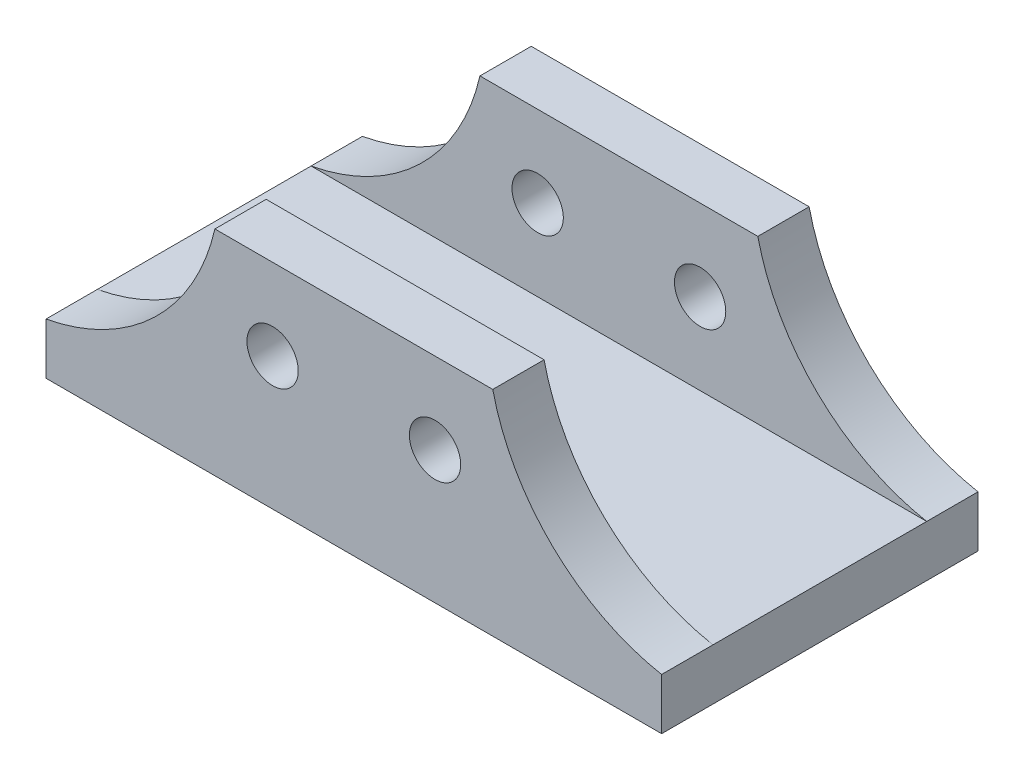
ISO-10303-21;
HEADER;
FILE_DESCRIPTION(('STEP AP214'),'2;1');
FILE_NAME('part.step','',(''),(''),'','','');
FILE_SCHEMA(('AUTOMOTIVE_DESIGN { 1 0 10303 214 1 1 1 1 }'));
ENDSEC;
DATA;
#1=APPLICATION_CONTEXT('core data for automotive mechanical design processes');
#2=APPLICATION_PROTOCOL_DEFINITION('international standard','automotive_design',2000,#1);
#3=PRODUCT_CONTEXT('',#1,'mechanical');
#4=PRODUCT('Part','Part','',(#3));
#5=PRODUCT_RELATED_PRODUCT_CATEGORY('part','',(#4));
#6=PRODUCT_DEFINITION_FORMATION('','',#4);
#7=PRODUCT_DEFINITION_CONTEXT('part definition',#1,'design');
#8=PRODUCT_DEFINITION('design','',#6,#7);
#9=PRODUCT_DEFINITION_SHAPE('','',#8);
#10=(LENGTH_UNIT() NAMED_UNIT(*) SI_UNIT(.MILLI.,.METRE.));
#11=(NAMED_UNIT(*) PLANE_ANGLE_UNIT() SI_UNIT($,.RADIAN.));
#12=(NAMED_UNIT(*) SI_UNIT($,.STERADIAN.) SOLID_ANGLE_UNIT());
#13=UNCERTAINTY_MEASURE_WITH_UNIT(LENGTH_MEASURE(1.E-05),#10,'distance_accuracy_value','');
#14=(GEOMETRIC_REPRESENTATION_CONTEXT(3) GLOBAL_UNCERTAINTY_ASSIGNED_CONTEXT((#13)) GLOBAL_UNIT_ASSIGNED_CONTEXT((#10,
#11,#12)) REPRESENTATION_CONTEXT('',''));
#15=CARTESIAN_POINT('',(0.,0.,0.));
#16=DIRECTION('',(0.,0.,1.));
#17=DIRECTION('',(1.,0.,0.));
#18=AXIS2_PLACEMENT_3D('',#15,#16,#17);
#19=CARTESIAN_POINT('',(81.2436376247931,61.1381233205086,12.));
#20=DIRECTION('',(0.,0.,-1.));
#21=DIRECTION('',(-1.,0.,0.));
#22=AXIS2_PLACEMENT_3D('',#19,#20,#21);
#23=PLANE('',#22);
#24=CARTESIAN_POINT('',(-19.,31.,12.));
#25=DIRECTION('',(0.,0.,1.));
#26=DIRECTION('',(-1.,0.,0.));
#27=AXIS2_PLACEMENT_3D('',#24,#25,#26);
#28=CIRCLE('',#27,6.);
#29=CARTESIAN_POINT('',(-25.,31.,12.));
#30=VERTEX_POINT('',#29);
#31=EDGE_CURVE('E201',#30,#30,#28,.T.);
#32=ORIENTED_EDGE('',*,*,#31,.F.);
#33=EDGE_LOOP('',(#32));
#34=FACE_BOUND('',#33,.T.);
#35=CARTESIAN_POINT('',(19.,31.,12.));
#36=DIRECTION('',(0.,0.,1.));
#37=DIRECTION('',(1.,0.,0.));
#38=AXIS2_PLACEMENT_3D('',#35,#36,#37);
#39=CIRCLE('',#38,6.);
#40=CARTESIAN_POINT('',(25.,31.,12.));
#41=VERTEX_POINT('',#40);
#42=EDGE_CURVE('E209',#41,#41,#39,.T.);
#43=ORIENTED_EDGE('',*,*,#42,.F.);
#44=EDGE_LOOP('',(#43));
#45=FACE_BOUND('',#44,.T.);
#46=DIRECTION('',(-1.,0.,0.));
#47=VECTOR('',#46,1.);
#48=CARTESIAN_POINT('',(-72.,12.,12.));
#49=LINE('',#48,#47);
#50=CARTESIAN_POINT('',(72.,12.,12.));
#51=VERTEX_POINT('',#50);
#52=CARTESIAN_POINT('',(-72.,12.,12.));
#53=VERTEX_POINT('',#52);
#54=EDGE_CURVE('E91',#51,#53,#49,.T.);
#55=ORIENTED_EDGE('',*,*,#54,.F.);
#56=CARTESIAN_POINT('',(81.2436376247931,61.1381233205086,12.));
#57=DIRECTION('',(0.,0.,-1.));
#58=DIRECTION('',(-1.,0.,0.));
#59=AXIS2_PLACEMENT_3D('',#56,#57,#58);
#60=CIRCLE('',#59,50.);
#61=CARTESIAN_POINT('',(32.5,50.,12.));
#62=VERTEX_POINT('',#61);
#63=EDGE_CURVE('E217',#51,#62,#60,.T.);
#64=ORIENTED_EDGE('',*,*,#63,.T.);
#65=DIRECTION('',(-1.,0.,0.));
#66=VECTOR('',#65,1.);
#67=CARTESIAN_POINT('',(-32.5,50.,12.));
#68=LINE('',#67,#66);
#69=CARTESIAN_POINT('',(-32.5,50.,12.));
#70=VERTEX_POINT('',#69);
#71=EDGE_CURVE('E57',#62,#70,#68,.T.);
#72=ORIENTED_EDGE('',*,*,#71,.T.);
#73=CARTESIAN_POINT('',(-81.2436376247931,61.1381233205086,12.));
#74=DIRECTION('',(0.,0.,-1.));
#75=DIRECTION('',(1.,0.,0.));
#76=AXIS2_PLACEMENT_3D('',#73,#74,#75);
#77=CIRCLE('',#76,50.);
#78=EDGE_CURVE('E222',#70,#53,#77,.T.);
#79=ORIENTED_EDGE('',*,*,#78,.T.);
#80=EDGE_LOOP('',(#55,#64,#72,#79));
#81=FACE_BOUND('',#80,.T.);
#82=ADVANCED_FACE('F39',(#34,#45,#81),#23,.F.);
#83=CARTESIAN_POINT('',(81.2436376247931,61.1381233205086,0.));
#84=DIRECTION('',(0.,0.,-1.));
#85=DIRECTION('',(-1.,0.,0.));
#86=AXIS2_PLACEMENT_3D('',#83,#84,#85);
#87=PLANE('',#86);
#88=CARTESIAN_POINT('',(19.,31.,0.));
#89=DIRECTION('',(0.,0.,1.));
#90=DIRECTION('',(1.,0.,0.));
#91=AXIS2_PLACEMENT_3D('',#88,#89,#90);
#92=CIRCLE('',#91,6.);
#93=CARTESIAN_POINT('',(25.,31.,0.));
#94=VERTEX_POINT('',#93);
#95=EDGE_CURVE('E205',#94,#94,#92,.T.);
#96=ORIENTED_EDGE('',*,*,#95,.T.);
#97=EDGE_LOOP('',(#96));
#98=FACE_BOUND('',#97,.T.);
#99=DIRECTION('',(0.,1.,0.));
#100=VECTOR('',#99,1.);
#101=CARTESIAN_POINT('',(72.,0.,0.));
#102=LINE('',#101,#100);
#103=CARTESIAN_POINT('',(72.,0.,0.));
#104=VERTEX_POINT('',#103);
#105=CARTESIAN_POINT('',(72.,12.,0.));
#106=VERTEX_POINT('',#105);
#107=EDGE_CURVE('E213',#104,#106,#102,.T.);
#108=ORIENTED_EDGE('',*,*,#107,.F.);
#109=DIRECTION('',(1.,0.,0.));
#110=VECTOR('',#109,1.);
#111=CARTESIAN_POINT('',(-72.,0.,0.));
#112=LINE('',#111,#110);
#113=CARTESIAN_POINT('',(-72.,0.,0.));
#114=VERTEX_POINT('',#113);
#115=EDGE_CURVE('E87',#114,#104,#112,.T.);
#116=ORIENTED_EDGE('',*,*,#115,.F.);
#117=DIRECTION('',(0.,-1.,0.));
#118=VECTOR('',#117,1.);
#119=CARTESIAN_POINT('',(-72.,0.,0.));
#120=LINE('',#119,#118);
#121=CARTESIAN_POINT('',(-72.,12.,0.));
#122=VERTEX_POINT('',#121);
#123=EDGE_CURVE('E81',#122,#114,#120,.T.);
#124=ORIENTED_EDGE('',*,*,#123,.F.);
#125=CARTESIAN_POINT('',(-81.2436376247931,61.1381233205086,0.));
#126=DIRECTION('',(0.,0.,-1.));
#127=DIRECTION('',(1.,0.,0.));
#128=AXIS2_PLACEMENT_3D('',#125,#126,#127);
#129=CIRCLE('',#128,50.);
#130=CARTESIAN_POINT('',(-32.5,50.,0.));
#131=VERTEX_POINT('',#130);
#132=EDGE_CURVE('E235',#131,#122,#129,.T.);
#133=ORIENTED_EDGE('',*,*,#132,.F.);
#134=DIRECTION('',(-1.,0.,0.));
#135=VECTOR('',#134,1.);
#136=CARTESIAN_POINT('',(-32.5,50.,0.));
#137=LINE('',#136,#135);
#138=CARTESIAN_POINT('',(32.5,50.,0.));
#139=VERTEX_POINT('',#138);
#140=EDGE_CURVE('E232',#139,#131,#137,.T.);
#141=ORIENTED_EDGE('',*,*,#140,.F.);
#142=CARTESIAN_POINT('',(81.2436376247931,61.1381233205086,0.));
#143=DIRECTION('',(0.,0.,-1.));
#144=DIRECTION('',(-1.,0.,0.));
#145=AXIS2_PLACEMENT_3D('',#142,#143,#144);
#146=CIRCLE('',#145,50.);
#147=EDGE_CURVE('E229',#106,#139,#146,.T.);
#148=ORIENTED_EDGE('',*,*,#147,.F.);
#149=EDGE_LOOP('',(#108,#116,#124,#133,#141,#148));
#150=FACE_BOUND('',#149,.T.);
#151=CARTESIAN_POINT('',(-19.,31.,0.));
#152=DIRECTION('',(0.,0.,1.));
#153=DIRECTION('',(-1.,0.,0.));
#154=AXIS2_PLACEMENT_3D('',#151,#152,#153);
#155=CIRCLE('',#154,6.);
#156=CARTESIAN_POINT('',(-25.,31.,0.));
#157=VERTEX_POINT('',#156);
#158=EDGE_CURVE('E193',#157,#157,#155,.T.);
#159=ORIENTED_EDGE('',*,*,#158,.T.);
#160=EDGE_LOOP('',(#159));
#161=FACE_BOUND('',#160,.T.);
#162=ADVANCED_FACE('F263',(#98,#150,#161),#87,.T.);
#163=CARTESIAN_POINT('',(72.,0.,12.));
#164=DIRECTION('',(-1.,0.,0.));
#165=DIRECTION('',(0.,0.,1.));
#166=AXIS2_PLACEMENT_3D('',#163,#164,#165);
#167=PLANE('',#166);
#168=ORIENTED_EDGE('',*,*,#107,.T.);
#169=DIRECTION('',(0.,0.,-1.));
#170=VECTOR('',#169,1.);
#171=CARTESIAN_POINT('',(72.,12.,12.));
#172=LINE('',#171,#170);
#173=EDGE_CURVE('E11',#51,#106,#172,.T.);
#174=ORIENTED_EDGE('',*,*,#173,.F.);
#175=DIRECTION('',(0.,0.,-1.));
#176=VECTOR('',#175,1.);
#177=CARTESIAN_POINT('',(72.,12.,206.499134945508));
#178=LINE('',#177,#176);
#179=CARTESIAN_POINT('',(72.,12.,62.));
#180=VERTEX_POINT('',#179);
#181=EDGE_CURVE('E194',#180,#51,#178,.T.);
#182=ORIENTED_EDGE('',*,*,#181,.F.);
#183=DIRECTION('',(0.,0.,1.));
#184=VECTOR('',#183,1.);
#185=CARTESIAN_POINT('',(72.,12.,62.));
#186=LINE('',#185,#184);
#187=CARTESIAN_POINT('',(72.,12.,74.));
#188=VERTEX_POINT('',#187);
#189=EDGE_CURVE('E138',#180,#188,#186,.T.);
#190=ORIENTED_EDGE('',*,*,#189,.T.);
#191=DIRECTION('',(0.,1.,0.));
#192=VECTOR('',#191,1.);
#193=CARTESIAN_POINT('',(72.,0.,74.));
#194=LINE('',#193,#192);
#195=CARTESIAN_POINT('',(72.,0.,74.));
#196=VERTEX_POINT('',#195);
#197=EDGE_CURVE('E160',#196,#188,#194,.T.);
#198=ORIENTED_EDGE('',*,*,#197,.F.);
#199=DIRECTION('',(0.,0.,-1.));
#200=VECTOR('',#199,1.);
#201=CARTESIAN_POINT('',(72.,0.,12.));
#202=LINE('',#201,#200);
#203=EDGE_CURVE('E225',#196,#104,#202,.T.);
#204=ORIENTED_EDGE('',*,*,#203,.T.);
#205=EDGE_LOOP('',(#168,#174,#182,#190,#198,#204));
#206=FACE_BOUND('',#205,.T.);
#207=ADVANCED_FACE('F41',(#206),#167,.F.);
#208=CARTESIAN_POINT('',(81.2436376247931,61.1381233205086,12.));
#209=DIRECTION('',(0.,0.,-1.));
#210=DIRECTION('',(-1.,0.,0.));
#211=AXIS2_PLACEMENT_3D('',#208,#209,#210);
#212=CYLINDRICAL_SURFACE('',#211,50.);
#213=ORIENTED_EDGE('',*,*,#147,.T.);
#214=DIRECTION('',(0.,0.,-1.));
#215=VECTOR('',#214,1.);
#216=CARTESIAN_POINT('',(32.5,50.,12.));
#217=LINE('',#216,#215);
#218=EDGE_CURVE('E49',#62,#139,#217,.T.);
#219=ORIENTED_EDGE('',*,*,#218,.F.);
#220=ORIENTED_EDGE('',*,*,#63,.F.);
#221=ORIENTED_EDGE('',*,*,#173,.T.);
#222=EDGE_LOOP('',(#213,#219,#220,#221));
#223=FACE_BOUND('',#222,.T.);
#224=ADVANCED_FACE('F277',(#223),#212,.F.);
#225=CARTESIAN_POINT('',(-32.5,50.,12.));
#226=DIRECTION('',(0.,-1.,0.));
#227=DIRECTION('',(0.,0.,-1.));
#228=AXIS2_PLACEMENT_3D('',#225,#226,#227);
#229=PLANE('',#228);
#230=ORIENTED_EDGE('',*,*,#140,.T.);
#231=DIRECTION('',(0.,0.,-1.));
#232=VECTOR('',#231,1.);
#233=CARTESIAN_POINT('',(-32.5,50.,12.));
#234=LINE('',#233,#232);
#235=EDGE_CURVE('E250',#70,#131,#234,.T.);
#236=ORIENTED_EDGE('',*,*,#235,.F.);
#237=ORIENTED_EDGE('',*,*,#71,.F.);
#238=ORIENTED_EDGE('',*,*,#218,.T.);
#239=EDGE_LOOP('',(#230,#236,#237,#238));
#240=FACE_BOUND('',#239,.T.);
#241=ADVANCED_FACE('F258',(#240),#229,.F.);
#242=CARTESIAN_POINT('',(-81.2436376247931,61.1381233205086,12.));
#243=DIRECTION('',(0.,0.,-1.));
#244=DIRECTION('',(-1.,0.,0.));
#245=AXIS2_PLACEMENT_3D('',#242,#243,#244);
#246=CYLINDRICAL_SURFACE('',#245,50.);
#247=ORIENTED_EDGE('',*,*,#132,.T.);
#248=DIRECTION('',(0.,0.,-1.));
#249=VECTOR('',#248,1.);
#250=CARTESIAN_POINT('',(-72.,12.,12.));
#251=LINE('',#250,#249);
#252=EDGE_CURVE('E247',#53,#122,#251,.T.);
#253=ORIENTED_EDGE('',*,*,#252,.F.);
#254=ORIENTED_EDGE('',*,*,#78,.F.);
#255=ORIENTED_EDGE('',*,*,#235,.T.);
#256=EDGE_LOOP('',(#247,#253,#254,#255));
#257=FACE_BOUND('',#256,.T.);
#258=ADVANCED_FACE('F266',(#257),#246,.F.);
#259=CARTESIAN_POINT('',(-72.,0.,12.));
#260=DIRECTION('',(1.,0.,0.));
#261=DIRECTION('',(0.,0.,-1.));
#262=AXIS2_PLACEMENT_3D('',#259,#260,#261);
#263=PLANE('',#262);
#264=ORIENTED_EDGE('',*,*,#123,.T.);
#265=DIRECTION('',(0.,0.,-1.));
#266=VECTOR('',#265,1.);
#267=CARTESIAN_POINT('',(-72.,0.,12.));
#268=LINE('',#267,#266);
#269=CARTESIAN_POINT('',(-72.,0.,74.));
#270=VERTEX_POINT('',#269);
#271=EDGE_CURVE('E244',#270,#114,#268,.T.);
#272=ORIENTED_EDGE('',*,*,#271,.F.);
#273=DIRECTION('',(0.,-1.,0.));
#274=VECTOR('',#273,1.);
#275=CARTESIAN_POINT('',(-72.,0.,74.));
#276=LINE('',#275,#274);
#277=CARTESIAN_POINT('',(-72.,12.,74.));
#278=VERTEX_POINT('',#277);
#279=EDGE_CURVE('E174',#278,#270,#276,.T.);
#280=ORIENTED_EDGE('',*,*,#279,.F.);
#281=DIRECTION('',(0.,0.,1.));
#282=VECTOR('',#281,1.);
#283=CARTESIAN_POINT('',(-72.,12.,62.));
#284=LINE('',#283,#282);
#285=CARTESIAN_POINT('',(-72.,12.,62.));
#286=VERTEX_POINT('',#285);
#287=EDGE_CURVE('E156',#286,#278,#284,.T.);
#288=ORIENTED_EDGE('',*,*,#287,.F.);
#289=DIRECTION('',(0.,0.,-1.));
#290=VECTOR('',#289,1.);
#291=CARTESIAN_POINT('',(-72.,12.,206.499134945508));
#292=LINE('',#291,#290);
#293=EDGE_CURVE('E189',#286,#53,#292,.T.);
#294=ORIENTED_EDGE('',*,*,#293,.T.);
#295=ORIENTED_EDGE('',*,*,#252,.T.);
#296=EDGE_LOOP('',(#264,#272,#280,#288,#294,#295));
#297=FACE_BOUND('',#296,.T.);
#298=ADVANCED_FACE('F268',(#297),#263,.F.);
#299=CARTESIAN_POINT('',(-72.,0.,12.));
#300=DIRECTION('',(0.,1.,0.));
#301=DIRECTION('',(0.,0.,1.));
#302=AXIS2_PLACEMENT_3D('',#299,#300,#301);
#303=PLANE('',#302);
#304=ORIENTED_EDGE('',*,*,#115,.T.);
#305=ORIENTED_EDGE('',*,*,#203,.F.);
#306=DIRECTION('',(1.,0.,0.));
#307=VECTOR('',#306,1.);
#308=CARTESIAN_POINT('',(-72.,0.,74.));
#309=LINE('',#308,#307);
#310=EDGE_CURVE('E148',#270,#196,#309,.T.);
#311=ORIENTED_EDGE('',*,*,#310,.F.);
#312=ORIENTED_EDGE('',*,*,#271,.T.);
#313=EDGE_LOOP('',(#304,#305,#311,#312));
#314=FACE_BOUND('',#313,.T.);
#315=ADVANCED_FACE('F292',(#314),#303,.F.);
#316=CARTESIAN_POINT('',(19.,31.,12.));
#317=DIRECTION('',(0.,0.,-1.));
#318=DIRECTION('',(-1.,0.,0.));
#319=AXIS2_PLACEMENT_3D('',#316,#317,#318);
#320=CYLINDRICAL_SURFACE('',#319,6.);
#321=ORIENTED_EDGE('',*,*,#42,.T.);
#322=EDGE_LOOP('',(#321));
#323=FACE_BOUND('',#322,.T.);
#324=ORIENTED_EDGE('',*,*,#95,.F.);
#325=EDGE_LOOP('',(#324));
#326=FACE_BOUND('',#325,.T.);
#327=ADVANCED_FACE('F289',(#323,#326),#320,.F.);
#328=CARTESIAN_POINT('',(-19.,31.,12.));
#329=DIRECTION('',(0.,0.,-1.));
#330=DIRECTION('',(-1.,0.,0.));
#331=AXIS2_PLACEMENT_3D('',#328,#329,#330);
#332=CYLINDRICAL_SURFACE('',#331,6.);
#333=ORIENTED_EDGE('',*,*,#31,.T.);
#334=EDGE_LOOP('',(#333));
#335=FACE_BOUND('',#334,.T.);
#336=ORIENTED_EDGE('',*,*,#158,.F.);
#337=EDGE_LOOP('',(#336));
#338=FACE_BOUND('',#337,.T.);
#339=ADVANCED_FACE('F334',(#335,#338),#332,.F.);
#340=CARTESIAN_POINT('',(-72.,12.,206.499134945508));
#341=DIRECTION('',(0.,-1.,0.));
#342=DIRECTION('',(0.,0.,-1.));
#343=AXIS2_PLACEMENT_3D('',#340,#341,#342);
#344=PLANE('',#343);
#345=DIRECTION('',(-1.,0.,0.));
#346=VECTOR('',#345,1.);
#347=CARTESIAN_POINT('',(-72.,12.,62.));
#348=LINE('',#347,#346);
#349=EDGE_CURVE('E190',#180,#286,#348,.T.);
#350=ORIENTED_EDGE('',*,*,#349,.F.);
#351=ORIENTED_EDGE('',*,*,#181,.T.);
#352=ORIENTED_EDGE('',*,*,#54,.T.);
#353=ORIENTED_EDGE('',*,*,#293,.F.);
#354=EDGE_LOOP('',(#350,#351,#352,#353));
#355=FACE_BOUND('',#354,.T.);
#356=ADVANCED_FACE('F273',(#355),#344,.F.);
#357=CARTESIAN_POINT('',(81.2436376247931,61.1381233205086,62.));
#358=DIRECTION('',(0.,0.,1.));
#359=DIRECTION('',(-1.,0.,0.));
#360=AXIS2_PLACEMENT_3D('',#357,#358,#359);
#361=PLANE('',#360);
#362=CARTESIAN_POINT('',(19.,31.,62.));
#363=DIRECTION('',(0.,0.,1.));
#364=DIRECTION('',(1.,0.,0.));
#365=AXIS2_PLACEMENT_3D('',#362,#363,#364);
#366=CIRCLE('',#365,6.);
#367=CARTESIAN_POINT('',(25.,31.,62.));
#368=VERTEX_POINT('',#367);
#369=EDGE_CURVE('E165',#368,#368,#366,.T.);
#370=ORIENTED_EDGE('',*,*,#369,.T.);
#371=EDGE_LOOP('',(#370));
#372=FACE_BOUND('',#371,.T.);
#373=CARTESIAN_POINT('',(-19.,31.,62.));
#374=DIRECTION('',(0.,0.,1.));
#375=DIRECTION('',(-1.,0.,0.));
#376=AXIS2_PLACEMENT_3D('',#373,#374,#375);
#377=CIRCLE('',#376,6.);
#378=CARTESIAN_POINT('',(-25.,31.,62.));
#379=VERTEX_POINT('',#378);
#380=EDGE_CURVE('E459',#379,#379,#377,.T.);
#381=ORIENTED_EDGE('',*,*,#380,.T.);
#382=EDGE_LOOP('',(#381));
#383=FACE_BOUND('',#382,.T.);
#384=CARTESIAN_POINT('',(81.2436376247931,61.1381233205086,62.));
#385=DIRECTION('',(0.,0.,-1.));
#386=DIRECTION('',(-1.,0.,0.));
#387=AXIS2_PLACEMENT_3D('',#384,#385,#386);
#388=CIRCLE('',#387,50.);
#389=CARTESIAN_POINT('',(32.5,50.,62.));
#390=VERTEX_POINT('',#389);
#391=EDGE_CURVE('E143',#180,#390,#388,.T.);
#392=ORIENTED_EDGE('',*,*,#391,.F.);
#393=ORIENTED_EDGE('',*,*,#349,.T.);
#394=CARTESIAN_POINT('',(-81.2436376247931,61.1381233205086,62.));
#395=DIRECTION('',(0.,0.,-1.));
#396=DIRECTION('',(1.,0.,0.));
#397=AXIS2_PLACEMENT_3D('',#394,#395,#396);
#398=CIRCLE('',#397,50.);
#399=CARTESIAN_POINT('',(-32.5,50.,62.));
#400=VERTEX_POINT('',#399);
#401=EDGE_CURVE('E152',#400,#286,#398,.T.);
#402=ORIENTED_EDGE('',*,*,#401,.F.);
#403=DIRECTION('',(-1.,0.,0.));
#404=VECTOR('',#403,1.);
#405=CARTESIAN_POINT('',(-32.5,50.,62.));
#406=LINE('',#405,#404);
#407=EDGE_CURVE('E130',#390,#400,#406,.T.);
#408=ORIENTED_EDGE('',*,*,#407,.F.);
#409=EDGE_LOOP('',(#392,#393,#402,#408));
#410=FACE_BOUND('',#409,.T.);
#411=ADVANCED_FACE('F150',(#372,#383,#410),#361,.F.);
#412=CARTESIAN_POINT('',(81.2436376247931,61.1381233205086,74.));
#413=DIRECTION('',(0.,0.,1.));
#414=DIRECTION('',(-1.,0.,0.));
#415=AXIS2_PLACEMENT_3D('',#412,#413,#414);
#416=PLANE('',#415);
#417=CARTESIAN_POINT('',(19.,31.,74.));
#418=DIRECTION('',(0.,0.,1.));
#419=DIRECTION('',(1.,0.,0.));
#420=AXIS2_PLACEMENT_3D('',#417,#418,#419);
#421=CIRCLE('',#420,6.);
#422=CARTESIAN_POINT('',(25.,31.,74.));
#423=VERTEX_POINT('',#422);
#424=EDGE_CURVE('E467',#423,#423,#421,.T.);
#425=ORIENTED_EDGE('',*,*,#424,.F.);
#426=EDGE_LOOP('',(#425));
#427=FACE_BOUND('',#426,.T.);
#428=ORIENTED_EDGE('',*,*,#197,.T.);
#429=CARTESIAN_POINT('',(81.2436376247931,61.1381233205086,74.));
#430=DIRECTION('',(0.,0.,-1.));
#431=DIRECTION('',(-1.,0.,0.));
#432=AXIS2_PLACEMENT_3D('',#429,#430,#431);
#433=CIRCLE('',#432,50.);
#434=CARTESIAN_POINT('',(32.5,50.,74.));
#435=VERTEX_POINT('',#434);
#436=EDGE_CURVE('E164',#188,#435,#433,.T.);
#437=ORIENTED_EDGE('',*,*,#436,.T.);
#438=DIRECTION('',(-1.,0.,0.));
#439=VECTOR('',#438,1.);
#440=CARTESIAN_POINT('',(-32.5,50.,74.));
#441=LINE('',#440,#439);
#442=CARTESIAN_POINT('',(-32.5,50.,74.));
#443=VERTEX_POINT('',#442);
#444=EDGE_CURVE('E133',#435,#443,#441,.T.);
#445=ORIENTED_EDGE('',*,*,#444,.T.);
#446=CARTESIAN_POINT('',(-81.2436376247931,61.1381233205086,74.));
#447=DIRECTION('',(0.,0.,-1.));
#448=DIRECTION('',(1.,0.,0.));
#449=AXIS2_PLACEMENT_3D('',#446,#447,#448);
#450=CIRCLE('',#449,50.);
#451=EDGE_CURVE('E170',#443,#278,#450,.T.);
#452=ORIENTED_EDGE('',*,*,#451,.T.);
#453=ORIENTED_EDGE('',*,*,#279,.T.);
#454=ORIENTED_EDGE('',*,*,#310,.T.);
#455=EDGE_LOOP('',(#428,#437,#445,#452,#453,#454));
#456=FACE_BOUND('',#455,.T.);
#457=CARTESIAN_POINT('',(-19.,31.,74.));
#458=DIRECTION('',(0.,0.,1.));
#459=DIRECTION('',(-1.,0.,0.));
#460=AXIS2_PLACEMENT_3D('',#457,#458,#459);
#461=CIRCLE('',#460,6.);
#462=CARTESIAN_POINT('',(-25.,31.,74.));
#463=VERTEX_POINT('',#462);
#464=EDGE_CURVE('E462',#463,#463,#461,.T.);
#465=ORIENTED_EDGE('',*,*,#464,.F.);
#466=EDGE_LOOP('',(#465));
#467=FACE_BOUND('',#466,.T.);
#468=ADVANCED_FACE('F358',(#427,#456,#467),#416,.T.);
#469=CARTESIAN_POINT('',(81.2436376247931,61.1381233205086,62.));
#470=DIRECTION('',(0.,0.,1.));
#471=DIRECTION('',(-1.,0.,0.));
#472=AXIS2_PLACEMENT_3D('',#469,#470,#471);
#473=CYLINDRICAL_SURFACE('',#472,50.);
#474=ORIENTED_EDGE('',*,*,#436,.F.);
#475=ORIENTED_EDGE('',*,*,#189,.F.);
#476=ORIENTED_EDGE('',*,*,#391,.T.);
#477=DIRECTION('',(0.,0.,1.));
#478=VECTOR('',#477,1.);
#479=CARTESIAN_POINT('',(32.5,50.,62.));
#480=LINE('',#479,#478);
#481=EDGE_CURVE('E126',#390,#435,#480,.T.);
#482=ORIENTED_EDGE('',*,*,#481,.T.);
#483=EDGE_LOOP('',(#474,#475,#476,#482));
#484=FACE_BOUND('',#483,.T.);
#485=ADVANCED_FACE('F144',(#484),#473,.F.);
#486=CARTESIAN_POINT('',(-32.5,50.,62.));
#487=DIRECTION('',(0.,-1.,0.));
#488=DIRECTION('',(0.,0.,1.));
#489=AXIS2_PLACEMENT_3D('',#486,#487,#488);
#490=PLANE('',#489);
#491=ORIENTED_EDGE('',*,*,#444,.F.);
#492=ORIENTED_EDGE('',*,*,#481,.F.);
#493=ORIENTED_EDGE('',*,*,#407,.T.);
#494=DIRECTION('',(0.,0.,1.));
#495=VECTOR('',#494,1.);
#496=CARTESIAN_POINT('',(-32.5,50.,62.));
#497=LINE('',#496,#495);
#498=EDGE_CURVE('E139',#400,#443,#497,.T.);
#499=ORIENTED_EDGE('',*,*,#498,.T.);
#500=EDGE_LOOP('',(#491,#492,#493,#499));
#501=FACE_BOUND('',#500,.T.);
#502=ADVANCED_FACE('F128',(#501),#490,.F.);
#503=CARTESIAN_POINT('',(-81.2436376247931,61.1381233205086,62.));
#504=DIRECTION('',(0.,0.,1.));
#505=DIRECTION('',(-1.,0.,0.));
#506=AXIS2_PLACEMENT_3D('',#503,#504,#505);
#507=CYLINDRICAL_SURFACE('',#506,50.);
#508=ORIENTED_EDGE('',*,*,#451,.F.);
#509=ORIENTED_EDGE('',*,*,#498,.F.);
#510=ORIENTED_EDGE('',*,*,#401,.T.);
#511=ORIENTED_EDGE('',*,*,#287,.T.);
#512=EDGE_LOOP('',(#508,#509,#510,#511));
#513=FACE_BOUND('',#512,.T.);
#514=ADVANCED_FACE('F383',(#513),#507,.F.);
#515=CARTESIAN_POINT('',(19.,31.,62.));
#516=DIRECTION('',(0.,0.,1.));
#517=DIRECTION('',(-1.,0.,0.));
#518=AXIS2_PLACEMENT_3D('',#515,#516,#517);
#519=CYLINDRICAL_SURFACE('',#518,6.);
#520=ORIENTED_EDGE('',*,*,#369,.F.);
#521=EDGE_LOOP('',(#520));
#522=FACE_BOUND('',#521,.T.);
#523=ORIENTED_EDGE('',*,*,#424,.T.);
#524=EDGE_LOOP('',(#523));
#525=FACE_BOUND('',#524,.T.);
#526=ADVANCED_FACE('F391',(#522,#525),#519,.F.);
#527=CARTESIAN_POINT('',(-19.,31.,62.));
#528=DIRECTION('',(0.,0.,1.));
#529=DIRECTION('',(-1.,0.,0.));
#530=AXIS2_PLACEMENT_3D('',#527,#528,#529);
#531=CYLINDRICAL_SURFACE('',#530,6.);
#532=ORIENTED_EDGE('',*,*,#380,.F.);
#533=EDGE_LOOP('',(#532));
#534=FACE_BOUND('',#533,.T.);
#535=ORIENTED_EDGE('',*,*,#464,.T.);
#536=EDGE_LOOP('',(#535));
#537=FACE_BOUND('',#536,.T.);
#538=ADVANCED_FACE('F400',(#534,#537),#531,.F.);
#539=CLOSED_SHELL('',(#82,#162,#207,#224,#241,#258,#298,#315,#327,#339,#356,#411,#468,#485,#502,
#514,#526,#538));
#540=MANIFOLD_SOLID_BREP('B2',#539);
#541=ADVANCED_BREP_SHAPE_REPRESENTATION('',(#18,#540),#14);
#542=SHAPE_DEFINITION_REPRESENTATION(#9,#541);
ENDSEC;
END-ISO-10303-21;
